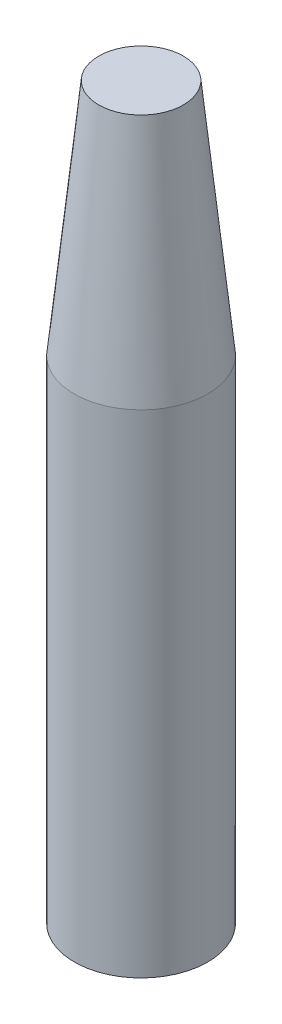
ISO-10303-21;
HEADER;
FILE_DESCRIPTION(('STEP AP214'),'2;1');
FILE_NAME('part.step','',(''),(''),'','','');
FILE_SCHEMA(('AUTOMOTIVE_DESIGN { 1 0 10303 214 1 1 1 1 }'));
ENDSEC;
DATA;
#1=APPLICATION_CONTEXT('core data for automotive mechanical design processes');
#2=APPLICATION_PROTOCOL_DEFINITION('international standard','automotive_design',2000,#1);
#3=PRODUCT_CONTEXT('',#1,'mechanical');
#4=PRODUCT('Part','Part','',(#3));
#5=PRODUCT_RELATED_PRODUCT_CATEGORY('part','',(#4));
#6=PRODUCT_DEFINITION_FORMATION('','',#4);
#7=PRODUCT_DEFINITION_CONTEXT('part definition',#1,'design');
#8=PRODUCT_DEFINITION('design','',#6,#7);
#9=PRODUCT_DEFINITION_SHAPE('','',#8);
#10=(LENGTH_UNIT() NAMED_UNIT(*) SI_UNIT(.MILLI.,.METRE.));
#11=(NAMED_UNIT(*) PLANE_ANGLE_UNIT() SI_UNIT($,.RADIAN.));
#12=(NAMED_UNIT(*) SI_UNIT($,.STERADIAN.) SOLID_ANGLE_UNIT());
#13=UNCERTAINTY_MEASURE_WITH_UNIT(LENGTH_MEASURE(1.E-05),#10,'distance_accuracy_value','');
#14=(GEOMETRIC_REPRESENTATION_CONTEXT(3) GLOBAL_UNCERTAINTY_ASSIGNED_CONTEXT((#13)) GLOBAL_UNIT_ASSIGNED_CONTEXT((#10,
#11,#12)) REPRESENTATION_CONTEXT('',''));
#15=CARTESIAN_POINT('',(0.,0.,0.));
#16=DIRECTION('',(0.,0.,1.));
#17=DIRECTION('',(1.,0.,0.));
#18=AXIS2_PLACEMENT_3D('',#15,#16,#17);
#19=CARTESIAN_POINT('',(0.,93.,0.));
#20=DIRECTION('',(0.,-1.,0.));
#21=DIRECTION('',(0.,0.,-1.));
#22=AXIS2_PLACEMENT_3D('',#19,#20,#21);
#23=CYLINDRICAL_SURFACE('',#22,12.625);
#24=CARTESIAN_POINT('',(0.,93.,0.));
#25=DIRECTION('',(0.,1.,0.));
#26=DIRECTION('',(0.,0.,1.));
#27=AXIS2_PLACEMENT_3D('',#24,#25,#26);
#28=CIRCLE('',#27,12.625);
#29=CARTESIAN_POINT('',(0.,93.,-12.625));
#30=VERTEX_POINT('',#29);
#31=EDGE_CURVE('E10',#30,#30,#28,.T.);
#32=CARTESIAN_POINT('',(0.,0.,0.));
#33=DIRECTION('',(0.,1.,0.));
#34=DIRECTION('',(0.,0.,1.));
#35=AXIS2_PLACEMENT_3D('',#32,#33,#34);
#36=CIRCLE('',#35,12.625);
#37=CARTESIAN_POINT('',(0.,0.,-12.625));
#38=VERTEX_POINT('',#37);
#39=EDGE_CURVE('E34',#38,#38,#36,.T.);
#40=CARTESIAN_POINT('',(0.,93.,-12.625));
#41=CARTESIAN_POINT('',(0.,92.03125,-12.625));
#42=CARTESIAN_POINT('',(0.,91.0625,-12.625));
#43=CARTESIAN_POINT('',(0.,89.125,-12.625));
#44=CARTESIAN_POINT('',(0.,88.15625,-12.625));
#45=CARTESIAN_POINT('',(0.,86.21875,-12.625));
#46=CARTESIAN_POINT('',(0.,85.25,-12.625));
#47=CARTESIAN_POINT('',(0.,83.3125,-12.625));
#48=CARTESIAN_POINT('',(0.,82.34375,-12.625));
#49=CARTESIAN_POINT('',(0.,80.40625,-12.625));
#50=CARTESIAN_POINT('',(0.,79.4375,-12.625));
#51=CARTESIAN_POINT('',(0.,77.5,-12.625));
#52=CARTESIAN_POINT('',(0.,76.53125,-12.625));
#53=CARTESIAN_POINT('',(0.,74.59375,-12.625));
#54=CARTESIAN_POINT('',(0.,73.625,-12.625));
#55=CARTESIAN_POINT('',(0.,71.6875,-12.625));
#56=CARTESIAN_POINT('',(0.,70.71875,-12.625));
#57=CARTESIAN_POINT('',(0.,68.78125,-12.625));
#58=CARTESIAN_POINT('',(0.,67.8125,-12.625));
#59=CARTESIAN_POINT('',(0.,65.875,-12.625));
#60=CARTESIAN_POINT('',(0.,64.90625,-12.625));
#61=CARTESIAN_POINT('',(0.,62.96875,-12.625));
#62=CARTESIAN_POINT('',(0.,62.,-12.625));
#63=CARTESIAN_POINT('',(0.,60.0625,-12.625));
#64=CARTESIAN_POINT('',(0.,59.09375,-12.625));
#65=CARTESIAN_POINT('',(0.,57.15625,-12.625));
#66=CARTESIAN_POINT('',(0.,56.1875,-12.625));
#67=CARTESIAN_POINT('',(0.,54.25,-12.625));
#68=CARTESIAN_POINT('',(0.,53.28125,-12.625));
#69=CARTESIAN_POINT('',(0.,51.34375,-12.625));
#70=CARTESIAN_POINT('',(0.,50.375,-12.625));
#71=CARTESIAN_POINT('',(0.,48.4375,-12.625));
#72=CARTESIAN_POINT('',(0.,47.46875,-12.625));
#73=CARTESIAN_POINT('',(0.,45.53125,-12.625));
#74=CARTESIAN_POINT('',(0.,44.5625,-12.625));
#75=CARTESIAN_POINT('',(0.,42.625,-12.625));
#76=CARTESIAN_POINT('',(0.,41.65625,-12.625));
#77=CARTESIAN_POINT('',(0.,39.71875,-12.625));
#78=CARTESIAN_POINT('',(0.,38.75,-12.625));
#79=CARTESIAN_POINT('',(0.,36.8125,-12.625));
#80=CARTESIAN_POINT('',(0.,35.84375,-12.625));
#81=CARTESIAN_POINT('',(0.,33.90625,-12.625));
#82=CARTESIAN_POINT('',(0.,32.9375,-12.625));
#83=CARTESIAN_POINT('',(0.,31.,-12.625));
#84=CARTESIAN_POINT('',(0.,30.03125,-12.625));
#85=CARTESIAN_POINT('',(0.,28.09375,-12.625));
#86=CARTESIAN_POINT('',(0.,27.125,-12.625));
#87=CARTESIAN_POINT('',(0.,25.1875,-12.625));
#88=CARTESIAN_POINT('',(0.,24.21875,-12.625));
#89=CARTESIAN_POINT('',(0.,22.28125,-12.625));
#90=CARTESIAN_POINT('',(0.,21.3125,-12.625));
#91=CARTESIAN_POINT('',(0.,19.375,-12.625));
#92=CARTESIAN_POINT('',(0.,18.40625,-12.625));
#93=CARTESIAN_POINT('',(0.,16.46875,-12.625));
#94=CARTESIAN_POINT('',(0.,15.5,-12.625));
#95=CARTESIAN_POINT('',(0.,13.5625,-12.625));
#96=CARTESIAN_POINT('',(0.,12.59375,-12.625));
#97=CARTESIAN_POINT('',(0.,10.65625,-12.625));
#98=CARTESIAN_POINT('',(0.,9.68749999999998,-12.625));
#99=CARTESIAN_POINT('',(0.,7.74999999999998,-12.625));
#100=CARTESIAN_POINT('',(0.,6.78124999999998,-12.625));
#101=CARTESIAN_POINT('',(0.,4.84374999999998,-12.625));
#102=CARTESIAN_POINT('',(0.,3.87499999999999,-12.625));
#103=CARTESIAN_POINT('',(0.,1.93749999999999,-12.625));
#104=CARTESIAN_POINT('',(0.,0.968749999999985,-12.625));
#105=CARTESIAN_POINT('',(0.,0.,-12.625));
#106=B_SPLINE_CURVE_WITH_KNOTS('',3,(#40,#41,#42,#43,#44,#45,#46,#47,#48,#49,#50,#51,#52,#53,
#54,#55,#56,#57,#58,#59,#60,#61,#62,#63,#64,#65,#66,#67,#68,#69,#70,#71,#72,#73,#74,#75,#76,#77,
#78,#79,#80,#81,#82,#83,#84,#85,#86,#87,#88,#89,#90,#91,#92,#93,#94,#95,#96,#97,#98,#99,#100,
#101,#102,#103,#104,#105),.UNSPECIFIED.,.F.,.F.,(4,2,2,2,2,2,2,2,2,2,2,2,2,2,2,2,2,2,2,2,2,2,2,
2,2,2,2,2,2,2,2,2,4),(0.,2.90625,5.8125,8.71875,11.625,14.53125,17.4375,20.34375,23.25,26.15625,
29.0625,31.96875,34.875,37.78125,40.6875,43.59375,46.5,49.40625,52.3125,55.21875,58.125,
61.03125,63.9375,66.84375,69.75,72.65625,75.5625,78.46875,81.375,84.28125,87.1875,90.09375,93.),.UNSPECIFIED.);
#107=EDGE_CURVE('BSEAM31',#30,#38,#106,.T.);
#108=ORIENTED_EDGE('',*,*,#31,.F.);
#109=ORIENTED_EDGE('',*,*,#39,.T.);
#110=ORIENTED_EDGE('',*,*,#107,.T.);
#111=ORIENTED_EDGE('',*,*,#107,.F.);
#112=EDGE_LOOP('',(#108,#110,#109,#111));
#113=FACE_BOUND('',#112,.T.);
#114=ADVANCED_FACE('F31',(#113),#23,.T.);
#115=CARTESIAN_POINT('',(0.,0.,0.));
#116=DIRECTION('',(0.,1.,0.));
#117=DIRECTION('',(0.,0.,1.));
#118=AXIS2_PLACEMENT_3D('',#115,#116,#117);
#119=PLANE('',#118);
#120=ORIENTED_EDGE('',*,*,#39,.F.);
#121=EDGE_LOOP('',(#120));
#122=FACE_BOUND('',#121,.T.);
#123=ADVANCED_FACE('F50',(#122),#119,.F.);
#124=CARTESIAN_POINT('',(0.,138.,0.));
#125=DIRECTION('',(0.,-1.,0.));
#126=DIRECTION('',(0.,0.,-1.));
#127=AXIS2_PLACEMENT_3D('',#124,#125,#126);
#128=CONICAL_SURFACE('',#127,8.,0.102418164396744);
#129=ORIENTED_EDGE('',*,*,#31,.T.);
#130=EDGE_LOOP('',(#129));
#131=FACE_BOUND('',#130,.T.);
#132=CARTESIAN_POINT('',(0.,138.,0.));
#133=DIRECTION('',(0.,1.,0.));
#134=DIRECTION('',(0.,0.,1.));
#135=AXIS2_PLACEMENT_3D('',#132,#133,#134);
#136=CIRCLE('',#135,8.);
#137=CARTESIAN_POINT('',(0.,138.,8.));
#138=VERTEX_POINT('',#137);
#139=EDGE_CURVE('E41',#138,#138,#136,.T.);
#140=ORIENTED_EDGE('',*,*,#139,.F.);
#141=EDGE_LOOP('',(#140));
#142=FACE_BOUND('',#141,.T.);
#143=ADVANCED_FACE('F48',(#131,#142),#128,.T.);
#144=CARTESIAN_POINT('',(0.,138.,0.));
#145=DIRECTION('',(0.,1.,0.));
#146=DIRECTION('',(0.,0.,1.));
#147=AXIS2_PLACEMENT_3D('',#144,#145,#146);
#148=PLANE('',#147);
#149=ORIENTED_EDGE('',*,*,#139,.T.);
#150=EDGE_LOOP('',(#149));
#151=FACE_BOUND('',#150,.T.);
#152=ADVANCED_FACE('F46',(#151),#148,.T.);
#153=CLOSED_SHELL('',(#114,#123,#143,#152));
#154=MANIFOLD_SOLID_BREP('B2',#153);
#155=ADVANCED_BREP_SHAPE_REPRESENTATION('',(#18,#154),#14);
#156=SHAPE_DEFINITION_REPRESENTATION(#9,#155);
ENDSEC;
END-ISO-10303-21;
